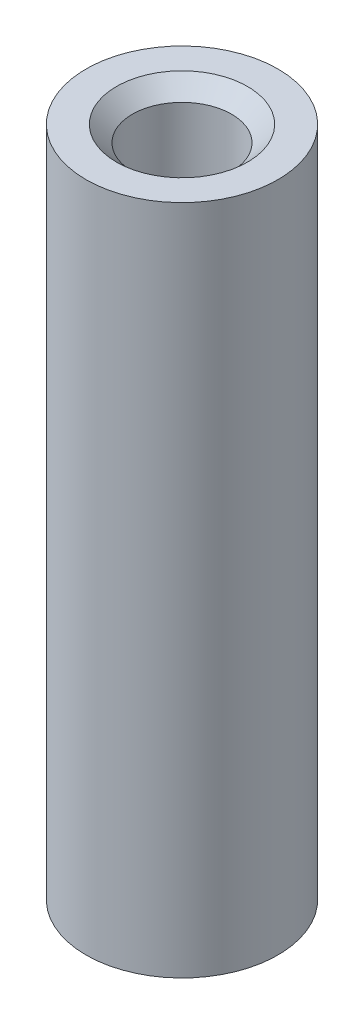
ISO-10303-21;
HEADER;
FILE_DESCRIPTION(('STEP AP214'),'2;1');
FILE_NAME('part.step','',(''),(''),'','','');
FILE_SCHEMA(('AUTOMOTIVE_DESIGN { 1 0 10303 214 1 1 1 1 }'));
ENDSEC;
DATA;
#1=APPLICATION_CONTEXT('core data for automotive mechanical design processes');
#2=APPLICATION_PROTOCOL_DEFINITION('international standard','automotive_design',2000,#1);
#3=PRODUCT_CONTEXT('',#1,'mechanical');
#4=PRODUCT('Part','Part','',(#3));
#5=PRODUCT_RELATED_PRODUCT_CATEGORY('part','',(#4));
#6=PRODUCT_DEFINITION_FORMATION('','',#4);
#7=PRODUCT_DEFINITION_CONTEXT('part definition',#1,'design');
#8=PRODUCT_DEFINITION('design','',#6,#7);
#9=PRODUCT_DEFINITION_SHAPE('','',#8);
#10=(LENGTH_UNIT() NAMED_UNIT(*) SI_UNIT(.MILLI.,.METRE.));
#11=(NAMED_UNIT(*) PLANE_ANGLE_UNIT() SI_UNIT($,.RADIAN.));
#12=(NAMED_UNIT(*) SI_UNIT($,.STERADIAN.) SOLID_ANGLE_UNIT());
#13=UNCERTAINTY_MEASURE_WITH_UNIT(LENGTH_MEASURE(1.E-05),#10,'distance_accuracy_value','');
#14=(GEOMETRIC_REPRESENTATION_CONTEXT(3) GLOBAL_UNCERTAINTY_ASSIGNED_CONTEXT((#13)) GLOBAL_UNIT_ASSIGNED_CONTEXT((#10,
#11,#12)) REPRESENTATION_CONTEXT('',''));
#15=CARTESIAN_POINT('',(0.,0.,0.));
#16=DIRECTION('',(0.,0.,1.));
#17=DIRECTION('',(1.,0.,0.));
#18=AXIS2_PLACEMENT_3D('',#15,#16,#17);
#19=CARTESIAN_POINT('',(0.,21.,0.));
#20=DIRECTION('',(0.,1.,0.));
#21=DIRECTION('',(0.,0.,1.));
#22=AXIS2_PLACEMENT_3D('',#19,#20,#21);
#23=PLANE('',#22);
#24=CARTESIAN_POINT('',(0.,21.,0.));
#25=DIRECTION('',(0.,1.,0.));
#26=DIRECTION('',(0.,0.,1.));
#27=AXIS2_PLACEMENT_3D('',#24,#25,#26);
#28=CIRCLE('',#27,2.05000000000001);
#29=CARTESIAN_POINT('',(0.,21.,2.05000000000001));
#30=VERTEX_POINT('',#29);
#31=EDGE_CURVE('E10',#30,#30,#28,.F.);
#32=ORIENTED_EDGE('',*,*,#31,.T.);
#33=EDGE_LOOP('',(#32));
#34=FACE_BOUND('',#33,.T.);
#35=CARTESIAN_POINT('',(0.,21.,0.));
#36=DIRECTION('',(0.,1.,0.));
#37=DIRECTION('',(0.,0.,1.));
#38=AXIS2_PLACEMENT_3D('',#35,#36,#37);
#39=CIRCLE('',#38,3.);
#40=CARTESIAN_POINT('',(0.,21.,-3.));
#41=VERTEX_POINT('',#40);
#42=EDGE_CURVE('E62',#41,#41,#39,.T.);
#43=ORIENTED_EDGE('',*,*,#42,.T.);
#44=EDGE_LOOP('',(#43));
#45=FACE_BOUND('',#44,.T.);
#46=ADVANCED_FACE('F41',(#34,#45),#23,.T.);
#47=CARTESIAN_POINT('',(0.,0.,0.));
#48=DIRECTION('',(0.,1.,0.));
#49=DIRECTION('',(0.,0.,1.));
#50=AXIS2_PLACEMENT_3D('',#47,#48,#49);
#51=PLANE('',#50);
#52=CARTESIAN_POINT('',(0.,0.,0.));
#53=DIRECTION('',(0.,1.,0.));
#54=DIRECTION('',(0.,0.,1.));
#55=AXIS2_PLACEMENT_3D('',#52,#53,#54);
#56=CIRCLE('',#55,2.05);
#57=CARTESIAN_POINT('',(0.,0.,2.05));
#58=VERTEX_POINT('',#57);
#59=EDGE_CURVE('E60',#58,#58,#56,.T.);
#60=ORIENTED_EDGE('',*,*,#59,.T.);
#61=EDGE_LOOP('',(#60));
#62=FACE_BOUND('',#61,.T.);
#63=CARTESIAN_POINT('',(0.,0.,0.));
#64=DIRECTION('',(0.,1.,0.));
#65=DIRECTION('',(0.,0.,1.));
#66=AXIS2_PLACEMENT_3D('',#63,#64,#65);
#67=CIRCLE('',#66,3.);
#68=CARTESIAN_POINT('',(0.,0.,-3.));
#69=VERTEX_POINT('',#68);
#70=EDGE_CURVE('E64',#69,#69,#67,.T.);
#71=ORIENTED_EDGE('',*,*,#70,.F.);
#72=EDGE_LOOP('',(#71));
#73=FACE_BOUND('',#72,.T.);
#74=ADVANCED_FACE('F74',(#62,#73),#51,.F.);
#75=CARTESIAN_POINT('',(0.,21.,0.));
#76=DIRECTION('',(0.,-1.,0.));
#77=DIRECTION('',(0.,0.,-1.));
#78=AXIS2_PLACEMENT_3D('',#75,#76,#77);
#79=CYLINDRICAL_SURFACE('',#78,3.);
#80=CARTESIAN_POINT('',(0.,21.,-3.));
#81=CARTESIAN_POINT('',(0.,20.78125,-3.));
#82=CARTESIAN_POINT('',(0.,20.5625,-3.));
#83=CARTESIAN_POINT('',(0.,20.125,-3.));
#84=CARTESIAN_POINT('',(0.,19.90625,-3.));
#85=CARTESIAN_POINT('',(0.,19.46875,-3.));
#86=CARTESIAN_POINT('',(0.,19.25,-3.));
#87=CARTESIAN_POINT('',(0.,18.8125,-3.));
#88=CARTESIAN_POINT('',(0.,18.59375,-3.));
#89=CARTESIAN_POINT('',(0.,18.15625,-3.));
#90=CARTESIAN_POINT('',(0.,17.9375,-3.));
#91=CARTESIAN_POINT('',(0.,17.5,-3.));
#92=CARTESIAN_POINT('',(0.,17.28125,-3.));
#93=CARTESIAN_POINT('',(0.,16.84375,-3.));
#94=CARTESIAN_POINT('',(0.,16.625,-3.));
#95=CARTESIAN_POINT('',(0.,16.1875,-3.));
#96=CARTESIAN_POINT('',(0.,15.96875,-3.));
#97=CARTESIAN_POINT('',(0.,15.53125,-3.));
#98=CARTESIAN_POINT('',(0.,15.3125,-3.));
#99=CARTESIAN_POINT('',(0.,14.875,-3.));
#100=CARTESIAN_POINT('',(0.,14.65625,-3.));
#101=CARTESIAN_POINT('',(0.,14.21875,-3.));
#102=CARTESIAN_POINT('',(0.,14.,-3.));
#103=CARTESIAN_POINT('',(0.,13.5625,-3.));
#104=CARTESIAN_POINT('',(0.,13.34375,-3.));
#105=CARTESIAN_POINT('',(0.,12.90625,-3.));
#106=CARTESIAN_POINT('',(0.,12.6875,-3.));
#107=CARTESIAN_POINT('',(0.,12.25,-3.));
#108=CARTESIAN_POINT('',(0.,12.03125,-3.));
#109=CARTESIAN_POINT('',(0.,11.59375,-3.));
#110=CARTESIAN_POINT('',(0.,11.375,-3.));
#111=CARTESIAN_POINT('',(0.,10.9375,-3.));
#112=CARTESIAN_POINT('',(0.,10.71875,-3.));
#113=CARTESIAN_POINT('',(0.,10.28125,-3.));
#114=CARTESIAN_POINT('',(0.,10.0625,-3.));
#115=CARTESIAN_POINT('',(0.,9.625,-3.));
#116=CARTESIAN_POINT('',(0.,9.40625,-3.));
#117=CARTESIAN_POINT('',(0.,8.96875,-3.));
#118=CARTESIAN_POINT('',(0.,8.75,-3.));
#119=CARTESIAN_POINT('',(0.,8.3125,-3.));
#120=CARTESIAN_POINT('',(0.,8.09375,-3.));
#121=CARTESIAN_POINT('',(0.,7.65625,-3.));
#122=CARTESIAN_POINT('',(0.,7.4375,-3.));
#123=CARTESIAN_POINT('',(0.,7.,-3.));
#124=CARTESIAN_POINT('',(0.,6.78125,-3.));
#125=CARTESIAN_POINT('',(0.,6.34375,-3.));
#126=CARTESIAN_POINT('',(0.,6.125,-3.));
#127=CARTESIAN_POINT('',(0.,5.6875,-3.));
#128=CARTESIAN_POINT('',(0.,5.46875,-3.));
#129=CARTESIAN_POINT('',(0.,5.03125,-3.));
#130=CARTESIAN_POINT('',(0.,4.8125,-3.));
#131=CARTESIAN_POINT('',(0.,4.375,-3.));
#132=CARTESIAN_POINT('',(0.,4.15625,-3.));
#133=CARTESIAN_POINT('',(0.,3.71875,-3.));
#134=CARTESIAN_POINT('',(0.,3.5,-3.));
#135=CARTESIAN_POINT('',(0.,3.0625,-3.));
#136=CARTESIAN_POINT('',(0.,2.84375,-3.));
#137=CARTESIAN_POINT('',(0.,2.40625,-3.));
#138=CARTESIAN_POINT('',(0.,2.1875,-3.));
#139=CARTESIAN_POINT('',(0.,1.75,-3.));
#140=CARTESIAN_POINT('',(0.,1.53125,-3.));
#141=CARTESIAN_POINT('',(0.,1.09375,-3.));
#142=CARTESIAN_POINT('',(0.,0.875000000000001,-3.));
#143=CARTESIAN_POINT('',(0.,0.4375,-3.));
#144=CARTESIAN_POINT('',(0.,0.21875,-3.));
#145=CARTESIAN_POINT('',(0.,0.,-3.));
#146=B_SPLINE_CURVE_WITH_KNOTS('',3,(#80,#81,#82,#83,#84,#85,#86,#87,#88,#89,#90,#91,#92,#93,
#94,#95,#96,#97,#98,#99,#100,#101,#102,#103,#104,#105,#106,#107,#108,#109,#110,#111,#112,#113,
#114,#115,#116,#117,#118,#119,#120,#121,#122,#123,#124,#125,#126,#127,#128,#129,#130,#131,#132,
#133,#134,#135,#136,#137,#138,#139,#140,#141,#142,#143,#144,#145),.UNSPECIFIED.,.F.,.F.,(4,2,2,
2,2,2,2,2,2,2,2,2,2,2,2,2,2,2,2,2,2,2,2,2,2,2,2,2,2,2,2,2,4),(0.,0.656249999999997,1.3125,
1.96875,2.625,3.28125,3.9375,4.59375,5.25,5.90625,6.5625,7.21875,7.875,8.53125,9.1875,9.84375,
10.5,11.15625,11.8125,12.46875,13.125,13.78125,14.4375,15.09375,15.75,16.40625,17.0625,17.71875,
18.375,19.03125,19.6875,20.34375,21.),.UNSPECIFIED.);
#147=EDGE_CURVE('BSEAM68',#41,#69,#146,.T.);
#148=ORIENTED_EDGE('',*,*,#42,.F.);
#149=ORIENTED_EDGE('',*,*,#70,.T.);
#150=ORIENTED_EDGE('',*,*,#147,.T.);
#151=ORIENTED_EDGE('',*,*,#147,.F.);
#152=EDGE_LOOP('',(#148,#150,#149,#151));
#153=FACE_BOUND('',#152,.T.);
#154=ADVANCED_FACE('F68',(#153),#79,.T.);
#155=CARTESIAN_POINT('',(0.,21.,0.));
#156=DIRECTION('',(0.,-1.,0.));
#157=DIRECTION('',(0.,0.,-1.));
#158=AXIS2_PLACEMENT_3D('',#155,#156,#157);
#159=CYLINDRICAL_SURFACE('',#158,1.55);
#160=CARTESIAN_POINT('',(0.,0.500000000000004,0.));
#161=DIRECTION('',(0.,1.,0.));
#162=DIRECTION('',(0.,0.,1.));
#163=AXIS2_PLACEMENT_3D('',#160,#161,#162);
#164=CIRCLE('',#163,1.55);
#165=CARTESIAN_POINT('',(0.,0.5,-1.55));
#166=VERTEX_POINT('',#165);
#167=EDGE_CURVE('E47',#166,#166,#164,.F.);
#168=CARTESIAN_POINT('',(0.,20.5,0.));
#169=DIRECTION('',(0.,1.,0.));
#170=DIRECTION('',(0.,0.,1.));
#171=AXIS2_PLACEMENT_3D('',#168,#169,#170);
#172=CIRCLE('',#171,1.55);
#173=CARTESIAN_POINT('',(0.,20.5,-1.55));
#174=VERTEX_POINT('',#173);
#175=EDGE_CURVE('E52',#174,#174,#172,.T.);
#176=CARTESIAN_POINT('',(0.,0.5,-1.55));
#177=CARTESIAN_POINT('',(0.,0.708333333333334,-1.55));
#178=CARTESIAN_POINT('',(0.,0.916666666666668,-1.55));
#179=CARTESIAN_POINT('',(0.,1.33333333333333,-1.55));
#180=CARTESIAN_POINT('',(0.,1.54166666666667,-1.55));
#181=CARTESIAN_POINT('',(0.,1.95833333333334,-1.55));
#182=CARTESIAN_POINT('',(0.,2.16666666666667,-1.55));
#183=CARTESIAN_POINT('',(0.,2.58333333333334,-1.55));
#184=CARTESIAN_POINT('',(0.,2.79166666666667,-1.55));
#185=CARTESIAN_POINT('',(0.,3.20833333333334,-1.55));
#186=CARTESIAN_POINT('',(0.,3.41666666666667,-1.55));
#187=CARTESIAN_POINT('',(0.,3.83333333333333,-1.55));
#188=CARTESIAN_POINT('',(0.,4.04166666666667,-1.55));
#189=CARTESIAN_POINT('',(0.,4.45833333333333,-1.55));
#190=CARTESIAN_POINT('',(0.,4.66666666666667,-1.55));
#191=CARTESIAN_POINT('',(0.,5.08333333333333,-1.55));
#192=CARTESIAN_POINT('',(0.,5.29166666666667,-1.55));
#193=CARTESIAN_POINT('',(0.,5.70833333333333,-1.55));
#194=CARTESIAN_POINT('',(0.,5.91666666666667,-1.55));
#195=CARTESIAN_POINT('',(0.,6.33333333333333,-1.55));
#196=CARTESIAN_POINT('',(0.,6.54166666666667,-1.55));
#197=CARTESIAN_POINT('',(0.,6.95833333333333,-1.55));
#198=CARTESIAN_POINT('',(0.,7.16666666666667,-1.55));
#199=CARTESIAN_POINT('',(0.,7.58333333333333,-1.55));
#200=CARTESIAN_POINT('',(0.,7.79166666666667,-1.55));
#201=CARTESIAN_POINT('',(0.,8.20833333333333,-1.55));
#202=CARTESIAN_POINT('',(0.,8.41666666666667,-1.55));
#203=CARTESIAN_POINT('',(0.,8.83333333333333,-1.55));
#204=CARTESIAN_POINT('',(0.,9.04166666666667,-1.55));
#205=CARTESIAN_POINT('',(0.,9.45833333333333,-1.55));
#206=CARTESIAN_POINT('',(0.,9.66666666666667,-1.55));
#207=CARTESIAN_POINT('',(0.,10.0833333333333,-1.55));
#208=CARTESIAN_POINT('',(0.,10.2916666666667,-1.55));
#209=CARTESIAN_POINT('',(0.,10.7083333333333,-1.55));
#210=CARTESIAN_POINT('',(0.,10.9166666666667,-1.55));
#211=CARTESIAN_POINT('',(0.,11.3333333333333,-1.55));
#212=CARTESIAN_POINT('',(0.,11.5416666666667,-1.55));
#213=CARTESIAN_POINT('',(0.,11.9583333333333,-1.55));
#214=CARTESIAN_POINT('',(0.,12.1666666666667,-1.55));
#215=CARTESIAN_POINT('',(0.,12.5833333333333,-1.55));
#216=CARTESIAN_POINT('',(0.,12.7916666666667,-1.55));
#217=CARTESIAN_POINT('',(0.,13.2083333333333,-1.55));
#218=CARTESIAN_POINT('',(0.,13.4166666666667,-1.55));
#219=CARTESIAN_POINT('',(0.,13.8333333333333,-1.55));
#220=CARTESIAN_POINT('',(0.,14.0416666666667,-1.55));
#221=CARTESIAN_POINT('',(0.,14.4583333333333,-1.55));
#222=CARTESIAN_POINT('',(0.,14.6666666666667,-1.55));
#223=CARTESIAN_POINT('',(0.,15.0833333333333,-1.55));
#224=CARTESIAN_POINT('',(0.,15.2916666666667,-1.55));
#225=CARTESIAN_POINT('',(0.,15.7083333333333,-1.55));
#226=CARTESIAN_POINT('',(0.,15.9166666666667,-1.55));
#227=CARTESIAN_POINT('',(0.,16.3333333333333,-1.55));
#228=CARTESIAN_POINT('',(0.,16.5416666666667,-1.55));
#229=CARTESIAN_POINT('',(0.,16.9583333333333,-1.55));
#230=CARTESIAN_POINT('',(0.,17.1666666666667,-1.55));
#231=CARTESIAN_POINT('',(0.,17.5833333333333,-1.55));
#232=CARTESIAN_POINT('',(0.,17.7916666666667,-1.55));
#233=CARTESIAN_POINT('',(0.,18.2083333333333,-1.55));
#234=CARTESIAN_POINT('',(0.,18.4166666666667,-1.55));
#235=CARTESIAN_POINT('',(0.,18.8333333333333,-1.55));
#236=CARTESIAN_POINT('',(0.,19.0416666666667,-1.55));
#237=CARTESIAN_POINT('',(0.,19.4583333333333,-1.55));
#238=CARTESIAN_POINT('',(0.,19.6666666666667,-1.55));
#239=CARTESIAN_POINT('',(0.,20.0833333333333,-1.55));
#240=CARTESIAN_POINT('',(0.,20.2916666666667,-1.55));
#241=CARTESIAN_POINT('',(0.,20.5,-1.55));
#242=B_SPLINE_CURVE_WITH_KNOTS('',3,(#176,#177,#178,#179,#180,#181,#182,#183,#184,#185,#186,
#187,#188,#189,#190,#191,#192,#193,#194,#195,#196,#197,#198,#199,#200,#201,#202,#203,#204,#205,
#206,#207,#208,#209,#210,#211,#212,#213,#214,#215,#216,#217,#218,#219,#220,#221,#222,#223,#224,
#225,#226,#227,#228,#229,#230,#231,#232,#233,#234,#235,#236,#237,#238,#239,#240,#241),
.UNSPECIFIED.,.F.,.F.,(4,2,2,2,2,2,2,2,2,2,2,2,2,2,2,2,2,2,2,2,2,2,2,2,2,2,2,2,2,2,2,2,4),(0.,
0.625000000000001,1.25,1.875,2.5,3.125,3.75,4.375,5.,5.625,6.25,6.875,7.5,8.125,8.75,9.375,10.,
10.625,11.25,11.875,12.5,13.125,13.75,14.375,15.,15.625,16.25,16.875,17.5,18.125,18.75,19.375,
20.),.UNSPECIFIED.);
#243=EDGE_CURVE('BSEAM71',#166,#174,#242,.T.);
#244=ORIENTED_EDGE('',*,*,#167,.T.);
#245=ORIENTED_EDGE('',*,*,#175,.T.);
#246=ORIENTED_EDGE('',*,*,#243,.T.);
#247=ORIENTED_EDGE('',*,*,#243,.F.);
#248=EDGE_LOOP('',(#244,#246,#245,#247));
#249=FACE_BOUND('',#248,.T.);
#250=ADVANCED_FACE('F71',(#249),#159,.F.);
#251=CARTESIAN_POINT('',(0.,0.,0.));
#252=DIRECTION('',(0.,-1.,0.));
#253=DIRECTION('',(0.,0.,-1.));
#254=AXIS2_PLACEMENT_3D('',#251,#252,#253);
#255=CONICAL_SURFACE('',#254,2.05,0.785398163397441);
#256=ORIENTED_EDGE('',*,*,#167,.F.);
#257=EDGE_LOOP('',(#256));
#258=FACE_BOUND('',#257,.T.);
#259=ORIENTED_EDGE('',*,*,#59,.F.);
#260=EDGE_LOOP('',(#259));
#261=FACE_BOUND('',#260,.T.);
#262=ADVANCED_FACE('F86',(#258,#261),#255,.F.);
#263=CARTESIAN_POINT('',(0.,20.5,0.));
#264=DIRECTION('',(0.,1.,0.));
#265=DIRECTION('',(0.,0.,1.));
#266=AXIS2_PLACEMENT_3D('',#263,#264,#265);
#267=CONICAL_SURFACE('',#266,1.55,0.785398163397458);
#268=ORIENTED_EDGE('',*,*,#31,.F.);
#269=EDGE_LOOP('',(#268));
#270=FACE_BOUND('',#269,.T.);
#271=ORIENTED_EDGE('',*,*,#175,.F.);
#272=EDGE_LOOP('',(#271));
#273=FACE_BOUND('',#272,.T.);
#274=ADVANCED_FACE('F42',(#270,#273),#267,.F.);
#275=CLOSED_SHELL('',(#46,#74,#154,#250,#262,#274));
#276=MANIFOLD_SOLID_BREP('B2',#275);
#277=ADVANCED_BREP_SHAPE_REPRESENTATION('',(#18,#276),#14);
#278=SHAPE_DEFINITION_REPRESENTATION(#9,#277);
ENDSEC;
END-ISO-10303-21;
